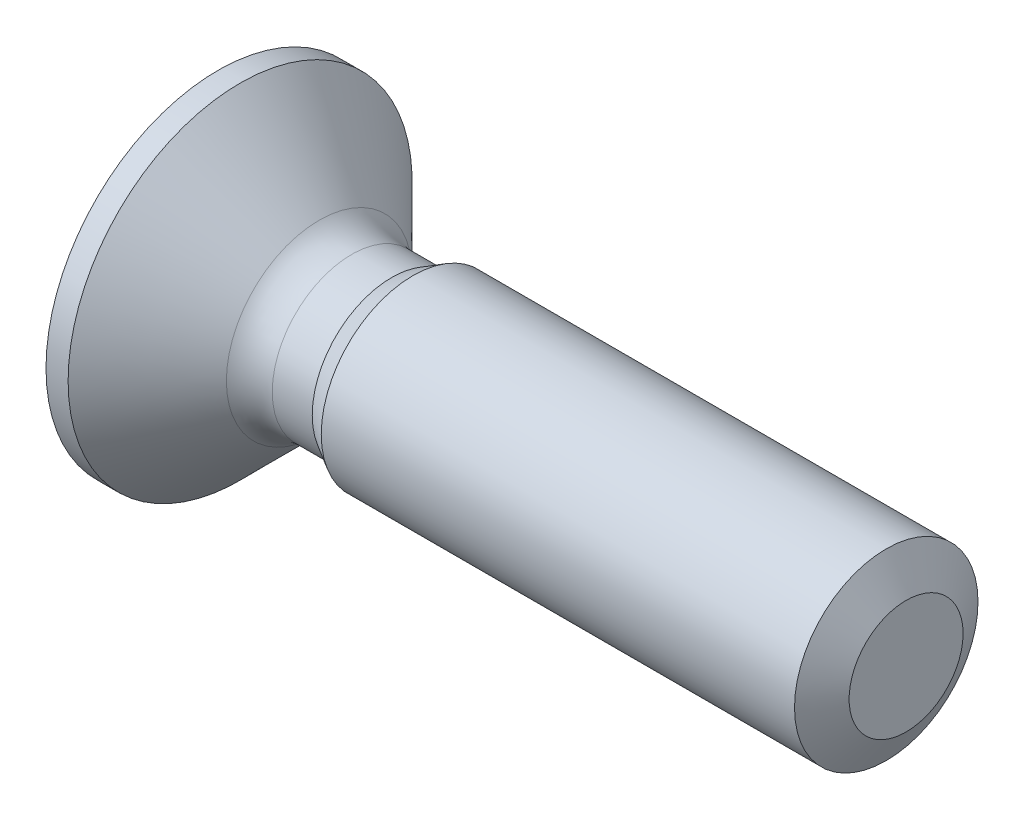
ISO-10303-21;
HEADER;
FILE_DESCRIPTION(('STEP AP214'),'2;1');
FILE_NAME('part.step','',(''),(''),'','','');
FILE_SCHEMA(('AUTOMOTIVE_DESIGN { 1 0 10303 214 1 1 1 1 }'));
ENDSEC;
DATA;
#1=APPLICATION_CONTEXT('core data for automotive mechanical design processes');
#2=APPLICATION_PROTOCOL_DEFINITION('international standard','automotive_design',2000,#1);
#3=PRODUCT_CONTEXT('',#1,'mechanical');
#4=PRODUCT('Part','Part','',(#3));
#5=PRODUCT_RELATED_PRODUCT_CATEGORY('part','',(#4));
#6=PRODUCT_DEFINITION_FORMATION('','',#4);
#7=PRODUCT_DEFINITION_CONTEXT('part definition',#1,'design');
#8=PRODUCT_DEFINITION('design','',#6,#7);
#9=PRODUCT_DEFINITION_SHAPE('','',#8);
#10=(LENGTH_UNIT() NAMED_UNIT(*) SI_UNIT(.MILLI.,.METRE.));
#11=(NAMED_UNIT(*) PLANE_ANGLE_UNIT() SI_UNIT($,.RADIAN.));
#12=(NAMED_UNIT(*) SI_UNIT($,.STERADIAN.) SOLID_ANGLE_UNIT());
#13=UNCERTAINTY_MEASURE_WITH_UNIT(LENGTH_MEASURE(1.E-05),#10,'distance_accuracy_value','');
#14=(GEOMETRIC_REPRESENTATION_CONTEXT(3) GLOBAL_UNCERTAINTY_ASSIGNED_CONTEXT((#13)) GLOBAL_UNIT_ASSIGNED_CONTEXT((#10,
#11,#12)) REPRESENTATION_CONTEXT('',''));
#15=CARTESIAN_POINT('',(0.,0.,0.));
#16=DIRECTION('',(0.,0.,1.));
#17=DIRECTION('',(1.,0.,0.));
#18=AXIS2_PLACEMENT_3D('',#15,#16,#17);
#19=CARTESIAN_POINT('',(0.,0.,0.));
#20=DIRECTION('',(1.,0.,0.));
#21=DIRECTION('',(0.,0.,-1.));
#22=AXIS2_PLACEMENT_3D('',#19,#20,#21);
#23=PLANE('',#22);
#24=CARTESIAN_POINT('',(0.,0.,0.));
#25=DIRECTION('',(-1.,0.,0.));
#26=DIRECTION('',(0.,0.,1.));
#27=AXIS2_PLACEMENT_3D('',#24,#25,#26);
#28=CIRCLE('',#27,1.5);
#29=CARTESIAN_POINT('',(0.,0.,1.5));
#30=VERTEX_POINT('',#29);
#31=EDGE_CURVE('E182',#30,#30,#28,.T.);
#32=ORIENTED_EDGE('',*,*,#31,.T.);
#33=EDGE_LOOP('',(#32));
#34=FACE_BOUND('',#33,.T.);
#35=DIRECTION('',(0.,1.,0.));
#36=VECTOR('',#35,1.);
#37=CARTESIAN_POINT('',(0.,0.799999999999999,0.175000000000003));
#38=LINE('',#37,#36);
#39=CARTESIAN_POINT('',(0.,0.175,0.175000000000001));
#40=VERTEX_POINT('',#39);
#41=CARTESIAN_POINT('',(0.,0.799999999999999,0.175000000000003));
#42=VERTEX_POINT('',#41);
#43=EDGE_CURVE('E104',#40,#42,#38,.T.);
#44=ORIENTED_EDGE('',*,*,#43,.F.);
#45=DIRECTION('',(0.,0.,-1.));
#46=VECTOR('',#45,1.);
#47=CARTESIAN_POINT('',(0.,0.175,-0.8));
#48=LINE('',#47,#46);
#49=CARTESIAN_POINT('',(0.,0.175,0.8));
#50=VERTEX_POINT('',#49);
#51=EDGE_CURVE('E149',#50,#40,#48,.T.);
#52=ORIENTED_EDGE('',*,*,#51,.F.);
#53=DIRECTION('',(0.,1.,0.));
#54=VECTOR('',#53,1.);
#55=CARTESIAN_POINT('',(0.,0.175,0.8));
#56=LINE('',#55,#54);
#57=CARTESIAN_POINT('',(0.,-0.175,0.8));
#58=VERTEX_POINT('',#57);
#59=EDGE_CURVE('E146',#58,#50,#56,.T.);
#60=ORIENTED_EDGE('',*,*,#59,.F.);
#61=DIRECTION('',(0.,0.,1.));
#62=VECTOR('',#61,1.);
#63=CARTESIAN_POINT('',(0.,-0.175,-0.8));
#64=LINE('',#63,#62);
#65=CARTESIAN_POINT('',(0.,-0.175,0.174999999999999));
#66=VERTEX_POINT('',#65);
#67=EDGE_CURVE('E77',#66,#58,#64,.T.);
#68=ORIENTED_EDGE('',*,*,#67,.F.);
#69=CARTESIAN_POINT('',(0.,-0.800000000000001,0.174999999999997));
#70=VERTEX_POINT('',#69);
#71=EDGE_CURVE('E112',#70,#66,#38,.T.);
#72=ORIENTED_EDGE('',*,*,#71,.F.);
#73=DIRECTION('',(0.,0.,1.));
#74=VECTOR('',#73,1.);
#75=CARTESIAN_POINT('',(0.,-0.800000000000001,0.174999999999997));
#76=LINE('',#75,#74);
#77=CARTESIAN_POINT('',(0.,-0.799999999999999,-0.175000000000003));
#78=VERTEX_POINT('',#77);
#79=EDGE_CURVE('E113',#78,#70,#76,.T.);
#80=ORIENTED_EDGE('',*,*,#79,.F.);
#81=DIRECTION('',(0.,-1.,0.));
#82=VECTOR('',#81,1.);
#83=CARTESIAN_POINT('',(0.,0.800000000000001,-0.174999999999997));
#84=LINE('',#83,#82);
#85=CARTESIAN_POINT('',(0.,-0.175,-0.175000000000001));
#86=VERTEX_POINT('',#85);
#87=EDGE_CURVE('E126',#86,#78,#84,.T.);
#88=ORIENTED_EDGE('',*,*,#87,.F.);
#89=CARTESIAN_POINT('',(0.,-0.175,-0.8));
#90=VERTEX_POINT('',#89);
#91=EDGE_CURVE('E143',#90,#86,#64,.T.);
#92=ORIENTED_EDGE('',*,*,#91,.F.);
#93=DIRECTION('',(0.,-1.,0.));
#94=VECTOR('',#93,1.);
#95=CARTESIAN_POINT('',(0.,0.175,-0.8));
#96=LINE('',#95,#94);
#97=CARTESIAN_POINT('',(0.,0.175,-0.8));
#98=VERTEX_POINT('',#97);
#99=EDGE_CURVE('E54',#98,#90,#96,.T.);
#100=ORIENTED_EDGE('',*,*,#99,.F.);
#101=CARTESIAN_POINT('',(0.,0.175,-0.174999999999999));
#102=VERTEX_POINT('',#101);
#103=EDGE_CURVE('E152',#102,#98,#48,.T.);
#104=ORIENTED_EDGE('',*,*,#103,.F.);
#105=CARTESIAN_POINT('',(0.,0.800000000000001,-0.174999999999997));
#106=VERTEX_POINT('',#105);
#107=EDGE_CURVE('E125',#106,#102,#84,.T.);
#108=ORIENTED_EDGE('',*,*,#107,.F.);
#109=DIRECTION('',(0.,0.,-1.));
#110=VECTOR('',#109,1.);
#111=CARTESIAN_POINT('',(0.,0.799999999999999,0.175000000000003));
#112=LINE('',#111,#110);
#113=EDGE_CURVE('E118',#42,#106,#112,.T.);
#114=ORIENTED_EDGE('',*,*,#113,.F.);
#115=EDGE_LOOP('',(#44,#52,#60,#68,#72,#80,#88,#92,#100,#104,#108,#114));
#116=FACE_BOUND('',#115,.T.);
#117=ADVANCED_FACE('F40',(#34,#116),#23,.F.);
#118=CARTESIAN_POINT('',(0.9,0.,0.));
#119=DIRECTION('',(-0.190869659102224,-0.981615389668581,0.));
#120=DIRECTION('',(0.981615389668581,-0.190869659102224,0.));
#121=AXIS2_PLACEMENT_3D('',#118,#119,#120);
#122=PLANE('',#121);
#123=ORIENTED_EDGE('',*,*,#51,.T.);
#124=DIRECTION('',(0.964208851210044,-0.187485054401953,-0.187485054401954));
#125=VECTOR('',#124,1.);
#126=CARTESIAN_POINT('',(0.9,0.,0.));
#127=LINE('',#126,#125);
#128=CARTESIAN_POINT('',(0.9,0.,0.));
#129=VERTEX_POINT('',#128);
#130=EDGE_CURVE('E83',#40,#129,#127,.T.);
#131=ORIENTED_EDGE('',*,*,#130,.T.);
#132=DIRECTION('',(0.739639285522949,-0.143818749962796,-0.657457142687066));
#133=VECTOR('',#132,1.);
#134=CARTESIAN_POINT('',(0.,0.175,0.8));
#135=LINE('',#134,#133);
#136=EDGE_CURVE('E63',#50,#129,#135,.T.);
#137=ORIENTED_EDGE('',*,*,#136,.F.);
#138=EDGE_LOOP('',(#123,#131,#137));
#139=FACE_BOUND('',#138,.T.);
#140=ADVANCED_FACE('F198',(#139),#122,.T.);
#141=DIRECTION('',(0.739639285522949,-0.143818749962796,0.657457142687066));
#142=VECTOR('',#141,1.);
#143=CARTESIAN_POINT('',(0.,0.175,-0.8));
#144=LINE('',#143,#142);
#145=EDGE_CURVE('E148',#98,#129,#144,.T.);
#146=ORIENTED_EDGE('',*,*,#145,.T.);
#147=DIRECTION('',(-0.964208851210045,0.187485054401953,-0.187485054401952));
#148=VECTOR('',#147,1.);
#149=CARTESIAN_POINT('',(0.9,0.,0.));
#150=LINE('',#149,#148);
#151=EDGE_CURVE('E130',#129,#102,#150,.T.);
#152=ORIENTED_EDGE('',*,*,#151,.T.);
#153=ORIENTED_EDGE('',*,*,#103,.T.);
#154=EDGE_LOOP('',(#146,#152,#153));
#155=FACE_BOUND('',#154,.T.);
#156=ADVANCED_FACE('F192',(#155),#122,.T.);
#157=CARTESIAN_POINT('',(0.9,0.,0.));
#158=DIRECTION('',(-0.190869659102224,0.981615389668581,0.));
#159=DIRECTION('',(-0.981615389668581,-0.190869659102224,0.));
#160=AXIS2_PLACEMENT_3D('',#157,#158,#159);
#161=PLANE('',#160);
#162=DIRECTION('',(0.739639285522949,0.143818749962796,-0.657457142687066));
#163=VECTOR('',#162,1.);
#164=CARTESIAN_POINT('',(0.,-0.175,0.8));
#165=LINE('',#164,#163);
#166=EDGE_CURVE('E142',#58,#129,#165,.T.);
#167=ORIENTED_EDGE('',*,*,#166,.T.);
#168=DIRECTION('',(-0.964208851210045,-0.187485054401953,0.187485054401952));
#169=VECTOR('',#168,1.);
#170=CARTESIAN_POINT('',(0.9,0.,0.));
#171=LINE('',#170,#169);
#172=EDGE_CURVE('E11',#129,#66,#171,.T.);
#173=ORIENTED_EDGE('',*,*,#172,.T.);
#174=ORIENTED_EDGE('',*,*,#67,.T.);
#175=EDGE_LOOP('',(#167,#173,#174));
#176=FACE_BOUND('',#175,.T.);
#177=ADVANCED_FACE('F193',(#176),#161,.T.);
#178=ORIENTED_EDGE('',*,*,#91,.T.);
#179=DIRECTION('',(0.964208851210044,0.187485054401953,0.187485054401954));
#180=VECTOR('',#179,1.);
#181=CARTESIAN_POINT('',(0.9,0.,0.));
#182=LINE('',#181,#180);
#183=EDGE_CURVE('E47',#86,#129,#182,.T.);
#184=ORIENTED_EDGE('',*,*,#183,.T.);
#185=DIRECTION('',(0.739639285522949,0.143818749962796,0.657457142687066));
#186=VECTOR('',#185,1.);
#187=CARTESIAN_POINT('',(0.,-0.175,-0.8));
#188=LINE('',#187,#186);
#189=EDGE_CURVE('E157',#90,#129,#188,.T.);
#190=ORIENTED_EDGE('',*,*,#189,.F.);
#191=EDGE_LOOP('',(#178,#184,#190));
#192=FACE_BOUND('',#191,.T.);
#193=ADVANCED_FACE('F186',(#192),#161,.T.);
#194=CARTESIAN_POINT('',(0.,0.,0.));
#195=DIRECTION('',(-1.,0.,0.));
#196=DIRECTION('',(0.,0.,1.));
#197=AXIS2_PLACEMENT_3D('',#194,#195,#196);
#198=CYLINDRICAL_SURFACE('',#197,1.5);
#199=ORIENTED_EDGE('',*,*,#31,.F.);
#200=EDGE_LOOP('',(#199));
#201=FACE_BOUND('',#200,.T.);
#202=CARTESIAN_POINT('',(0.192800000000003,0.,0.));
#203=DIRECTION('',(-1.,0.,0.));
#204=DIRECTION('',(0.,0.,1.));
#205=AXIS2_PLACEMENT_3D('',#202,#203,#204);
#206=CIRCLE('',#205,1.5);
#207=CARTESIAN_POINT('',(0.192800000000003,0.,1.5));
#208=VERTEX_POINT('',#207);
#209=EDGE_CURVE('E178',#208,#208,#206,.T.);
#210=ORIENTED_EDGE('',*,*,#209,.T.);
#211=EDGE_LOOP('',(#210));
#212=FACE_BOUND('',#211,.T.);
#213=ADVANCED_FACE('F226',(#201,#212),#198,.T.);
#214=CARTESIAN_POINT('',(0.882842712474619,0.,0.));
#215=DIRECTION('',(-1.,0.,0.));
#216=DIRECTION('',(0.,0.,1.));
#217=AXIS2_PLACEMENT_3D('',#214,#215,#216);
#218=CONICAL_SURFACE('',#217,0.809957287525381,0.78539816339745);
#219=ORIENTED_EDGE('',*,*,#209,.F.);
#220=EDGE_LOOP('',(#219));
#221=FACE_BOUND('',#220,.T.);
#222=CARTESIAN_POINT('',(0.882842712474619,0.,0.));
#223=DIRECTION('',(-1.,0.,0.));
#224=DIRECTION('',(0.,0.,1.));
#225=AXIS2_PLACEMENT_3D('',#222,#223,#224);
#226=CIRCLE('',#225,0.809957287525381);
#227=CARTESIAN_POINT('',(0.882842712474619,0.,0.809957287525381));
#228=VERTEX_POINT('',#227);
#229=EDGE_CURVE('E174',#228,#228,#226,.T.);
#230=ORIENTED_EDGE('',*,*,#229,.T.);
#231=EDGE_LOOP('',(#230));
#232=FACE_BOUND('',#231,.T.);
#233=ADVANCED_FACE('F229',(#221,#232),#218,.T.);
#234=CARTESIAN_POINT('',(1.16568542494924,0.,0.));
#235=DIRECTION('',(-1.,0.,0.));
#236=DIRECTION('',(0.,0.,1.));
#237=AXIS2_PLACEMENT_3D('',#234,#235,#236);
#238=TOROIDAL_SURFACE('',#237,1.0928,0.4);
#239=ORIENTED_EDGE('',*,*,#229,.F.);
#240=EDGE_LOOP('',(#239));
#241=FACE_BOUND('',#240,.T.);
#242=CARTESIAN_POINT('',(1.16568542494924,0.,0.));
#243=DIRECTION('',(-1.,0.,0.));
#244=DIRECTION('',(0.,0.,1.));
#245=AXIS2_PLACEMENT_3D('',#242,#243,#244);
#246=CIRCLE('',#245,0.6928);
#247=CARTESIAN_POINT('',(1.16568542494924,0.,0.6928));
#248=VERTEX_POINT('',#247);
#249=EDGE_CURVE('E171',#248,#248,#246,.T.);
#250=ORIENTED_EDGE('',*,*,#249,.T.);
#251=EDGE_LOOP('',(#250));
#252=FACE_BOUND('',#251,.T.);
#253=ADVANCED_FACE('F234',(#241,#252),#238,.F.);
#254=CARTESIAN_POINT('',(0.,0.,0.));
#255=DIRECTION('',(-1.,0.,0.));
#256=DIRECTION('',(0.,0.,1.));
#257=AXIS2_PLACEMENT_3D('',#254,#255,#256);
#258=CYLINDRICAL_SURFACE('',#257,0.6928);
#259=ORIENTED_EDGE('',*,*,#249,.F.);
#260=EDGE_LOOP('',(#259));
#261=FACE_BOUND('',#260,.T.);
#262=CARTESIAN_POINT('',(1.51432415342862,0.,0.));
#263=DIRECTION('',(-1.,0.,0.));
#264=DIRECTION('',(0.,0.,1.));
#265=AXIS2_PLACEMENT_3D('',#262,#263,#264);
#266=CIRCLE('',#265,0.6928);
#267=CARTESIAN_POINT('',(1.51432415342862,0.,0.6928));
#268=VERTEX_POINT('',#267);
#269=EDGE_CURVE('E168',#268,#268,#266,.T.);
#270=ORIENTED_EDGE('',*,*,#269,.T.);
#271=EDGE_LOOP('',(#270));
#272=FACE_BOUND('',#271,.T.);
#273=ADVANCED_FACE('F240',(#261,#272),#258,.T.);
#274=CARTESIAN_POINT('',(1.7,0.,0.));
#275=DIRECTION('',(1.,0.,0.));
#276=DIRECTION('',(0.,0.,-1.));
#277=AXIS2_PLACEMENT_3D('',#274,#275,#276);
#278=CONICAL_SURFACE('',#277,0.8,0.5235987755983);
#279=ORIENTED_EDGE('',*,*,#269,.F.);
#280=EDGE_LOOP('',(#279));
#281=FACE_BOUND('',#280,.T.);
#282=CARTESIAN_POINT('',(1.7,0.,0.));
#283=DIRECTION('',(-1.,0.,0.));
#284=DIRECTION('',(0.,0.,1.));
#285=AXIS2_PLACEMENT_3D('',#282,#283,#284);
#286=CIRCLE('',#285,0.8);
#287=CARTESIAN_POINT('',(1.7,0.,0.8));
#288=VERTEX_POINT('',#287);
#289=EDGE_CURVE('E165',#288,#288,#286,.T.);
#290=ORIENTED_EDGE('',*,*,#289,.T.);
#291=EDGE_LOOP('',(#290));
#292=FACE_BOUND('',#291,.T.);
#293=ADVANCED_FACE('F246',(#281,#292),#278,.T.);
#294=CARTESIAN_POINT('',(0.,0.,0.));
#295=DIRECTION('',(-1.,0.,0.));
#296=DIRECTION('',(0.,0.,1.));
#297=AXIS2_PLACEMENT_3D('',#294,#295,#296);
#298=CYLINDRICAL_SURFACE('',#297,0.8);
#299=CARTESIAN_POINT('',(5.8268956020098,0.,0.));
#300=DIRECTION('',(1.,0.,0.));
#301=DIRECTION('',(0.,0.,-1.));
#302=AXIS2_PLACEMENT_3D('',#299,#300,#301);
#303=CIRCLE('',#302,0.799999999999999);
#304=CARTESIAN_POINT('',(5.8268956020098,0.,-0.799999999999999));
#305=VERTEX_POINT('',#304);
#306=EDGE_CURVE('E162',#305,#305,#303,.T.);
#307=ORIENTED_EDGE('',*,*,#306,.F.);
#308=EDGE_LOOP('',(#307));
#309=FACE_BOUND('',#308,.T.);
#310=ORIENTED_EDGE('',*,*,#289,.F.);
#311=EDGE_LOOP('',(#310));
#312=FACE_BOUND('',#311,.T.);
#313=ADVANCED_FACE('F252',(#309,#312),#298,.T.);
#314=CARTESIAN_POINT('',(5.8268956020098,0.,0.));
#315=DIRECTION('',(-1.,0.,0.));
#316=DIRECTION('',(0.,0.,1.));
#317=AXIS2_PLACEMENT_3D('',#314,#315,#316);
#318=CONICAL_SURFACE('',#317,0.799999999999999,1.05188801855118);
#319=CARTESIAN_POINT('',(6.,0.,0.));
#320=DIRECTION('',(1.,0.,0.));
#321=DIRECTION('',(0.,0.,-1.));
#322=AXIS2_PLACEMENT_3D('',#319,#320,#321);
#323=CIRCLE('',#322,0.496899999999999);
#324=CARTESIAN_POINT('',(6.,0.,-0.496899999999999));
#325=VERTEX_POINT('',#324);
#326=EDGE_CURVE('E151',#325,#325,#323,.T.);
#327=ORIENTED_EDGE('',*,*,#326,.F.);
#328=EDGE_LOOP('',(#327));
#329=FACE_BOUND('',#328,.T.);
#330=ORIENTED_EDGE('',*,*,#306,.T.);
#331=EDGE_LOOP('',(#330));
#332=FACE_BOUND('',#331,.T.);
#333=ADVANCED_FACE('F257',(#329,#332),#318,.T.);
#334=CARTESIAN_POINT('',(6.,0.8,0.));
#335=DIRECTION('',(-1.,0.,0.));
#336=DIRECTION('',(0.,0.,1.));
#337=AXIS2_PLACEMENT_3D('',#334,#335,#336);
#338=PLANE('',#337);
#339=ORIENTED_EDGE('',*,*,#326,.T.);
#340=EDGE_LOOP('',(#339));
#341=FACE_BOUND('',#340,.T.);
#342=ADVANCED_FACE('F263',(#341),#338,.F.);
#343=CARTESIAN_POINT('',(0.,0.175,-0.8));
#344=DIRECTION('',(0.66436383882992,0.,-0.74740931868366));
#345=DIRECTION('',(-0.74740931868366,0.,-0.66436383882992));
#346=AXIS2_PLACEMENT_3D('',#343,#344,#345);
#347=PLANE('',#346);
#348=ORIENTED_EDGE('',*,*,#145,.F.);
#349=ORIENTED_EDGE('',*,*,#99,.T.);
#350=ORIENTED_EDGE('',*,*,#189,.T.);
#351=EDGE_LOOP('',(#348,#349,#350));
#352=FACE_BOUND('',#351,.T.);
#353=ADVANCED_FACE('F190',(#352),#347,.F.);
#354=CARTESIAN_POINT('',(0.,-0.175,0.8));
#355=DIRECTION('',(0.66436383882992,0.,0.74740931868366));
#356=DIRECTION('',(0.74740931868366,0.,-0.66436383882992));
#357=AXIS2_PLACEMENT_3D('',#354,#355,#356);
#358=PLANE('',#357);
#359=ORIENTED_EDGE('',*,*,#166,.F.);
#360=ORIENTED_EDGE('',*,*,#59,.T.);
#361=ORIENTED_EDGE('',*,*,#136,.T.);
#362=EDGE_LOOP('',(#359,#360,#361));
#363=FACE_BOUND('',#362,.T.);
#364=ADVANCED_FACE('F197',(#363),#358,.F.);
#365=CARTESIAN_POINT('',(0.9,0.,0.));
#366=DIRECTION('',(-0.190869659102224,0.,-0.981615389668581));
#367=DIRECTION('',(0.981615389668581,0.,-0.190869659102224));
#368=AXIS2_PLACEMENT_3D('',#365,#366,#367);
#369=PLANE('',#368);
#370=DIRECTION('',(0.739639285522949,0.657457142687066,-0.143818749962793));
#371=VECTOR('',#370,1.);
#372=CARTESIAN_POINT('',(0.,-0.800000000000001,0.174999999999997));
#373=LINE('',#372,#371);
#374=EDGE_CURVE('E122',#70,#129,#373,.T.);
#375=ORIENTED_EDGE('',*,*,#374,.F.);
#376=ORIENTED_EDGE('',*,*,#71,.T.);
#377=ORIENTED_EDGE('',*,*,#172,.F.);
#378=EDGE_LOOP('',(#375,#376,#377));
#379=FACE_BOUND('',#378,.T.);
#380=ADVANCED_FACE('F202',(#379),#369,.T.);
#381=CARTESIAN_POINT('',(0.9,0.,0.));
#382=DIRECTION('',(-0.190869659102224,0.,0.981615389668581));
#383=DIRECTION('',(-0.981615389668581,0.,-0.190869659102224));
#384=AXIS2_PLACEMENT_3D('',#381,#382,#383);
#385=PLANE('',#384);
#386=ORIENTED_EDGE('',*,*,#87,.T.);
#387=DIRECTION('',(0.739639285522949,0.657457142687065,0.143818749962798));
#388=VECTOR('',#387,1.);
#389=CARTESIAN_POINT('',(0.,-0.799999999999999,-0.175000000000003));
#390=LINE('',#389,#388);
#391=EDGE_CURVE('E136',#78,#129,#390,.T.);
#392=ORIENTED_EDGE('',*,*,#391,.T.);
#393=ORIENTED_EDGE('',*,*,#183,.F.);
#394=EDGE_LOOP('',(#386,#392,#393));
#395=FACE_BOUND('',#394,.T.);
#396=ADVANCED_FACE('F206',(#395),#385,.T.);
#397=CARTESIAN_POINT('',(0.,-0.799999999999999,-0.175000000000003));
#398=DIRECTION('',(0.66436383882992,-0.74740931868366,0.));
#399=DIRECTION('',(0.74740931868366,0.66436383882992,0.));
#400=AXIS2_PLACEMENT_3D('',#397,#398,#399);
#401=PLANE('',#400);
#402=ORIENTED_EDGE('',*,*,#391,.F.);
#403=ORIENTED_EDGE('',*,*,#79,.T.);
#404=ORIENTED_EDGE('',*,*,#374,.T.);
#405=EDGE_LOOP('',(#402,#403,#404));
#406=FACE_BOUND('',#405,.T.);
#407=ADVANCED_FACE('F205',(#406),#401,.F.);
#408=ORIENTED_EDGE('',*,*,#43,.T.);
#409=DIRECTION('',(0.739639285522949,-0.657457142687065,-0.143818749962798));
#410=VECTOR('',#409,1.);
#411=CARTESIAN_POINT('',(0.,0.799999999999999,0.175000000000003));
#412=LINE('',#411,#410);
#413=EDGE_CURVE('E107',#42,#129,#412,.T.);
#414=ORIENTED_EDGE('',*,*,#413,.T.);
#415=ORIENTED_EDGE('',*,*,#130,.F.);
#416=EDGE_LOOP('',(#408,#414,#415));
#417=FACE_BOUND('',#416,.T.);
#418=ADVANCED_FACE('F106',(#417),#369,.T.);
#419=DIRECTION('',(0.739639285522949,-0.657457142687066,0.143818749962793));
#420=VECTOR('',#419,1.);
#421=CARTESIAN_POINT('',(0.,0.800000000000001,-0.174999999999997));
#422=LINE('',#421,#420);
#423=EDGE_CURVE('E120',#106,#129,#422,.T.);
#424=ORIENTED_EDGE('',*,*,#423,.F.);
#425=ORIENTED_EDGE('',*,*,#107,.T.);
#426=ORIENTED_EDGE('',*,*,#151,.F.);
#427=EDGE_LOOP('',(#424,#425,#426));
#428=FACE_BOUND('',#427,.T.);
#429=ADVANCED_FACE('F209',(#428),#385,.T.);
#430=CARTESIAN_POINT('',(0.,0.799999999999999,0.175000000000003));
#431=DIRECTION('',(0.66436383882992,0.74740931868366,0.));
#432=DIRECTION('',(-0.74740931868366,0.66436383882992,0.));
#433=AXIS2_PLACEMENT_3D('',#430,#431,#432);
#434=PLANE('',#433);
#435=ORIENTED_EDGE('',*,*,#413,.F.);
#436=ORIENTED_EDGE('',*,*,#113,.T.);
#437=ORIENTED_EDGE('',*,*,#423,.T.);
#438=EDGE_LOOP('',(#435,#436,#437));
#439=FACE_BOUND('',#438,.T.);
#440=ADVANCED_FACE('F117',(#439),#434,.F.);
#441=CLOSED_SHELL('',(#117,#140,#156,#177,#193,#213,#233,#253,#273,#293,#313,#333,#342,#353,
#364,#380,#396,#407,#418,#429,#440));
#442=MANIFOLD_SOLID_BREP('B2',#441);
#443=ADVANCED_BREP_SHAPE_REPRESENTATION('',(#18,#442),#14);
#444=SHAPE_DEFINITION_REPRESENTATION(#9,#443);
ENDSEC;
END-ISO-10303-21;
